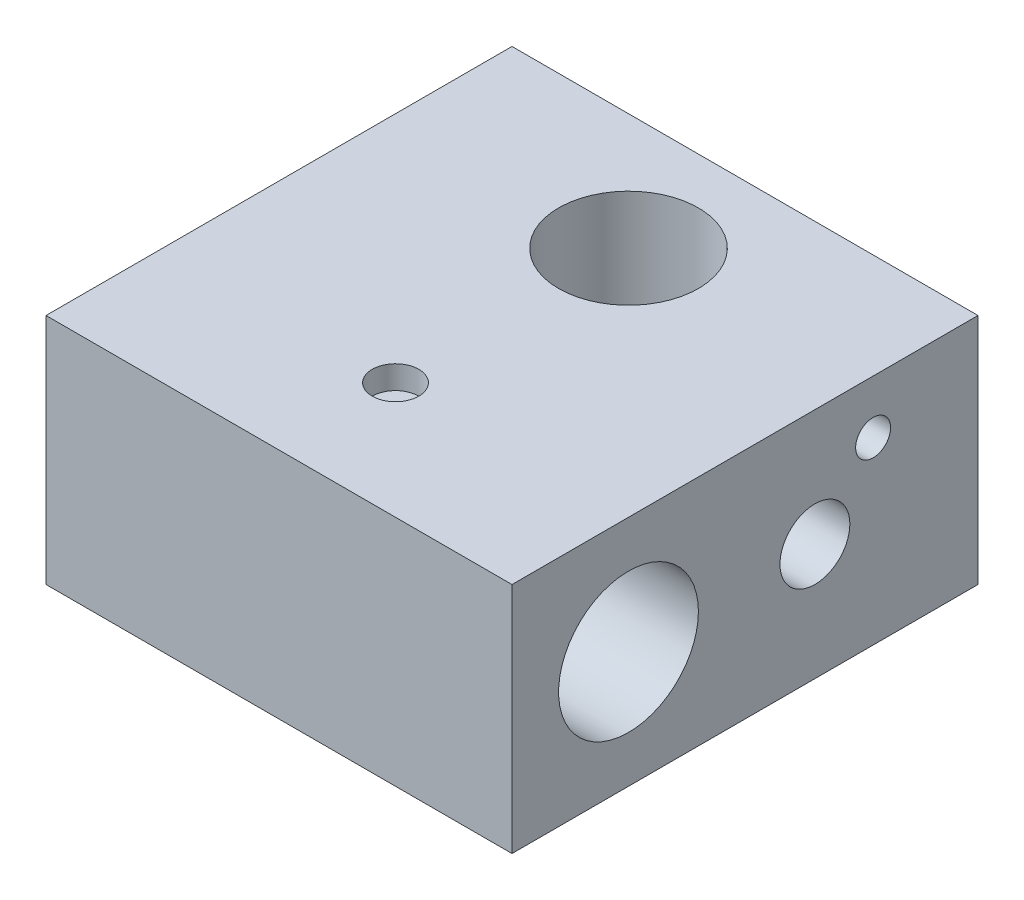
ISO-10303-21;
HEADER;
FILE_DESCRIPTION(('STEP AP214'),'2;1');
FILE_NAME('part.step','',(''),(''),'','','');
FILE_SCHEMA(('AUTOMOTIVE_DESIGN { 1 0 10303 214 1 1 1 1 }'));
ENDSEC;
DATA;
#1=APPLICATION_CONTEXT('core data for automotive mechanical design processes');
#2=APPLICATION_PROTOCOL_DEFINITION('international standard','automotive_design',2000,#1);
#3=PRODUCT_CONTEXT('',#1,'mechanical');
#4=PRODUCT('Part','Part','',(#3));
#5=PRODUCT_RELATED_PRODUCT_CATEGORY('part','',(#4));
#6=PRODUCT_DEFINITION_FORMATION('','',#4);
#7=PRODUCT_DEFINITION_CONTEXT('part definition',#1,'design');
#8=PRODUCT_DEFINITION('design','',#6,#7);
#9=PRODUCT_DEFINITION_SHAPE('','',#8);
#10=(LENGTH_UNIT() NAMED_UNIT(*) SI_UNIT(.MILLI.,.METRE.));
#11=(NAMED_UNIT(*) PLANE_ANGLE_UNIT() SI_UNIT($,.RADIAN.));
#12=(NAMED_UNIT(*) SI_UNIT($,.STERADIAN.) SOLID_ANGLE_UNIT());
#13=UNCERTAINTY_MEASURE_WITH_UNIT(LENGTH_MEASURE(1.E-05),#10,'distance_accuracy_value','');
#14=(GEOMETRIC_REPRESENTATION_CONTEXT(3) GLOBAL_UNCERTAINTY_ASSIGNED_CONTEXT((#13)) GLOBAL_UNIT_ASSIGNED_CONTEXT((#10,
#11,#12)) REPRESENTATION_CONTEXT('',''));
#15=CARTESIAN_POINT('',(0.,0.,0.));
#16=DIRECTION('',(0.,0.,1.));
#17=DIRECTION('',(1.,0.,0.));
#18=AXIS2_PLACEMENT_3D('',#15,#16,#17);
#19=CARTESIAN_POINT('',(10.,-5.,20.));
#20=DIRECTION('',(-1.,0.,0.));
#21=DIRECTION('',(0.,0.,1.));
#22=AXIS2_PLACEMENT_3D('',#19,#20,#21);
#23=PLANE('',#22);
#24=CARTESIAN_POINT('',(10.,0.,7.));
#25=DIRECTION('',(1.,0.,0.));
#26=DIRECTION('',(0.,0.,-1.));
#27=AXIS2_PLACEMENT_3D('',#24,#25,#26);
#28=CIRCLE('',#27,1.5);
#29=CARTESIAN_POINT('',(10.,0.,5.5));
#30=VERTEX_POINT('',#29);
#31=EDGE_CURVE('E133',#30,#30,#28,.T.);
#32=ORIENTED_EDGE('',*,*,#31,.F.);
#33=EDGE_LOOP('',(#32));
#34=FACE_BOUND('',#33,.T.);
#35=CARTESIAN_POINT('',(10.,2.71005655513205,4.50192394619593));
#36=DIRECTION('',(1.,0.,0.));
#37=DIRECTION('',(0.,0.,-1.));
#38=AXIS2_PLACEMENT_3D('',#35,#36,#37);
#39=CIRCLE('',#38,0.75);
#40=CARTESIAN_POINT('',(10.,2.71005655513205,3.75192394619593));
#41=VERTEX_POINT('',#40);
#42=EDGE_CURVE('E127',#41,#41,#39,.T.);
#43=ORIENTED_EDGE('',*,*,#42,.F.);
#44=EDGE_LOOP('',(#43));
#45=FACE_BOUND('',#44,.T.);
#46=CARTESIAN_POINT('',(10.,0.,15.));
#47=DIRECTION('',(1.,0.,0.));
#48=DIRECTION('',(0.,0.,-1.));
#49=AXIS2_PLACEMENT_3D('',#46,#47,#48);
#50=CIRCLE('',#49,3.);
#51=CARTESIAN_POINT('',(10.,0.,12.));
#52=VERTEX_POINT('',#51);
#53=EDGE_CURVE('E121',#52,#52,#50,.T.);
#54=ORIENTED_EDGE('',*,*,#53,.F.);
#55=EDGE_LOOP('',(#54));
#56=FACE_BOUND('',#55,.T.);
#57=DIRECTION('',(0.,1.,0.));
#58=VECTOR('',#57,1.);
#59=CARTESIAN_POINT('',(10.,-5.,0.));
#60=LINE('',#59,#58);
#61=CARTESIAN_POINT('',(10.,-5.,0.));
#62=VERTEX_POINT('',#61);
#63=CARTESIAN_POINT('',(10.,5.,0.));
#64=VERTEX_POINT('',#63);
#65=EDGE_CURVE('E95',#62,#64,#60,.T.);
#66=ORIENTED_EDGE('',*,*,#65,.T.);
#67=DIRECTION('',(0.,0.,-1.));
#68=VECTOR('',#67,1.);
#69=CARTESIAN_POINT('',(10.,5.,20.));
#70=LINE('',#69,#68);
#71=CARTESIAN_POINT('',(10.,5.,20.));
#72=VERTEX_POINT('',#71);
#73=EDGE_CURVE('E11',#72,#64,#70,.T.);
#74=ORIENTED_EDGE('',*,*,#73,.F.);
#75=DIRECTION('',(0.,1.,0.));
#76=VECTOR('',#75,1.);
#77=CARTESIAN_POINT('',(10.,-5.,20.));
#78=LINE('',#77,#76);
#79=CARTESIAN_POINT('',(10.,-5.,20.));
#80=VERTEX_POINT('',#79);
#81=EDGE_CURVE('E83',#80,#72,#78,.T.);
#82=ORIENTED_EDGE('',*,*,#81,.F.);
#83=DIRECTION('',(0.,0.,-1.));
#84=VECTOR('',#83,1.);
#85=CARTESIAN_POINT('',(10.,-5.,20.));
#86=LINE('',#85,#84);
#87=EDGE_CURVE('E91',#80,#62,#86,.T.);
#88=ORIENTED_EDGE('',*,*,#87,.T.);
#89=EDGE_LOOP('',(#66,#74,#82,#88));
#90=FACE_BOUND('',#89,.T.);
#91=ADVANCED_FACE('F32',(#34,#45,#56,#90),#23,.F.);
#92=CARTESIAN_POINT('',(-10.,5.,20.));
#93=DIRECTION('',(0.,-1.,0.));
#94=DIRECTION('',(0.,0.,-1.));
#95=AXIS2_PLACEMENT_3D('',#92,#93,#94);
#96=PLANE('',#95);
#97=CARTESIAN_POINT('',(0.,5.,15.));
#98=DIRECTION('',(0.,1.,0.));
#99=DIRECTION('',(0.,0.,1.));
#100=AXIS2_PLACEMENT_3D('',#97,#98,#99);
#101=CIRCLE('',#100,1.);
#102=CARTESIAN_POINT('',(0.,5.,16.));
#103=VERTEX_POINT('',#102);
#104=EDGE_CURVE('E115',#103,#103,#101,.T.);
#105=ORIENTED_EDGE('',*,*,#104,.F.);
#106=EDGE_LOOP('',(#105));
#107=FACE_BOUND('',#106,.T.);
#108=CARTESIAN_POINT('',(0.,5.,5.));
#109=DIRECTION('',(0.,1.,0.));
#110=DIRECTION('',(0.,0.,1.));
#111=AXIS2_PLACEMENT_3D('',#108,#109,#110);
#112=CIRCLE('',#111,3.);
#113=CARTESIAN_POINT('',(0.,5.,8.));
#114=VERTEX_POINT('',#113);
#115=EDGE_CURVE('E109',#114,#114,#112,.T.);
#116=ORIENTED_EDGE('',*,*,#115,.F.);
#117=EDGE_LOOP('',(#116));
#118=FACE_BOUND('',#117,.T.);
#119=DIRECTION('',(-1.,0.,0.));
#120=VECTOR('',#119,1.);
#121=CARTESIAN_POINT('',(-10.,5.,0.));
#122=LINE('',#121,#120);
#123=CARTESIAN_POINT('',(-10.,5.,0.));
#124=VERTEX_POINT('',#123);
#125=EDGE_CURVE('E87',#64,#124,#122,.T.);
#126=ORIENTED_EDGE('',*,*,#125,.T.);
#127=DIRECTION('',(0.,0.,-1.));
#128=VECTOR('',#127,1.);
#129=CARTESIAN_POINT('',(-10.,5.,20.));
#130=LINE('',#129,#128);
#131=CARTESIAN_POINT('',(-10.,5.,20.));
#132=VERTEX_POINT('',#131);
#133=EDGE_CURVE('E40',#132,#124,#130,.T.);
#134=ORIENTED_EDGE('',*,*,#133,.F.);
#135=DIRECTION('',(-1.,0.,0.));
#136=VECTOR('',#135,1.);
#137=CARTESIAN_POINT('',(-10.,5.,20.));
#138=LINE('',#137,#136);
#139=EDGE_CURVE('E78',#72,#132,#138,.T.);
#140=ORIENTED_EDGE('',*,*,#139,.F.);
#141=ORIENTED_EDGE('',*,*,#73,.T.);
#142=EDGE_LOOP('',(#126,#134,#140,#141));
#143=FACE_BOUND('',#142,.T.);
#144=ADVANCED_FACE('F86',(#107,#118,#143),#96,.F.);
#145=CARTESIAN_POINT('',(-10.,-5.,20.));
#146=DIRECTION('',(1.,0.,0.));
#147=DIRECTION('',(0.,0.,-1.));
#148=AXIS2_PLACEMENT_3D('',#145,#146,#147);
#149=PLANE('',#148);
#150=CARTESIAN_POINT('',(-10.,0.,15.));
#151=DIRECTION('',(1.,0.,0.));
#152=DIRECTION('',(0.,0.,-1.));
#153=AXIS2_PLACEMENT_3D('',#150,#151,#152);
#154=CIRCLE('',#153,3.);
#155=CARTESIAN_POINT('',(-10.,0.,12.));
#156=VERTEX_POINT('',#155);
#157=EDGE_CURVE('E118',#156,#156,#154,.T.);
#158=ORIENTED_EDGE('',*,*,#157,.T.);
#159=EDGE_LOOP('',(#158));
#160=FACE_BOUND('',#159,.T.);
#161=DIRECTION('',(0.,-1.,0.));
#162=VECTOR('',#161,1.);
#163=CARTESIAN_POINT('',(-10.,-5.,0.));
#164=LINE('',#163,#162);
#165=CARTESIAN_POINT('',(-10.,-5.,0.));
#166=VERTEX_POINT('',#165);
#167=EDGE_CURVE('E65',#124,#166,#164,.T.);
#168=ORIENTED_EDGE('',*,*,#167,.T.);
#169=DIRECTION('',(0.,0.,-1.));
#170=VECTOR('',#169,1.);
#171=CARTESIAN_POINT('',(-10.,-5.,20.));
#172=LINE('',#171,#170);
#173=CARTESIAN_POINT('',(-10.,-5.,20.));
#174=VERTEX_POINT('',#173);
#175=EDGE_CURVE('E88',#174,#166,#172,.T.);
#176=ORIENTED_EDGE('',*,*,#175,.F.);
#177=DIRECTION('',(0.,-1.,0.));
#178=VECTOR('',#177,1.);
#179=CARTESIAN_POINT('',(-10.,-5.,20.));
#180=LINE('',#179,#178);
#181=EDGE_CURVE('E81',#132,#174,#180,.T.);
#182=ORIENTED_EDGE('',*,*,#181,.F.);
#183=ORIENTED_EDGE('',*,*,#133,.T.);
#184=EDGE_LOOP('',(#168,#176,#182,#183));
#185=FACE_BOUND('',#184,.T.);
#186=ADVANCED_FACE('F89',(#160,#185),#149,.F.);
#187=CARTESIAN_POINT('',(-10.,-5.,20.));
#188=DIRECTION('',(0.,1.,0.));
#189=DIRECTION('',(0.,0.,1.));
#190=AXIS2_PLACEMENT_3D('',#187,#188,#189);
#191=PLANE('',#190);
#192=CARTESIAN_POINT('',(0.,-5.,5.));
#193=DIRECTION('',(0.,1.,0.));
#194=DIRECTION('',(0.,0.,1.));
#195=AXIS2_PLACEMENT_3D('',#192,#193,#194);
#196=CIRCLE('',#195,3.);
#197=CARTESIAN_POINT('',(0.,-5.,8.));
#198=VERTEX_POINT('',#197);
#199=EDGE_CURVE('E98',#198,#198,#196,.T.);
#200=ORIENTED_EDGE('',*,*,#199,.T.);
#201=EDGE_LOOP('',(#200));
#202=FACE_BOUND('',#201,.T.);
#203=DIRECTION('',(1.,0.,0.));
#204=VECTOR('',#203,1.);
#205=CARTESIAN_POINT('',(-10.,-5.,0.));
#206=LINE('',#205,#204);
#207=EDGE_CURVE('E71',#166,#62,#206,.T.);
#208=ORIENTED_EDGE('',*,*,#207,.T.);
#209=ORIENTED_EDGE('',*,*,#87,.F.);
#210=DIRECTION('',(1.,0.,0.));
#211=VECTOR('',#210,1.);
#212=CARTESIAN_POINT('',(-10.,-5.,20.));
#213=LINE('',#212,#211);
#214=EDGE_CURVE('E48',#174,#80,#213,.T.);
#215=ORIENTED_EDGE('',*,*,#214,.F.);
#216=ORIENTED_EDGE('',*,*,#175,.T.);
#217=EDGE_LOOP('',(#208,#209,#215,#216));
#218=FACE_BOUND('',#217,.T.);
#219=ADVANCED_FACE('F103',(#202,#218),#191,.F.);
#220=CARTESIAN_POINT('',(0.,0.,20.));
#221=DIRECTION('',(0.,0.,-1.));
#222=DIRECTION('',(-1.,0.,0.));
#223=AXIS2_PLACEMENT_3D('',#220,#221,#222);
#224=PLANE('',#223);
#225=ORIENTED_EDGE('',*,*,#81,.T.);
#226=ORIENTED_EDGE('',*,*,#139,.T.);
#227=ORIENTED_EDGE('',*,*,#181,.T.);
#228=ORIENTED_EDGE('',*,*,#214,.T.);
#229=EDGE_LOOP('',(#225,#226,#227,#228));
#230=FACE_BOUND('',#229,.T.);
#231=ADVANCED_FACE('F79',(#230),#224,.F.);
#232=CARTESIAN_POINT('',(0.,0.,0.));
#233=DIRECTION('',(0.,0.,-1.));
#234=DIRECTION('',(-1.,0.,0.));
#235=AXIS2_PLACEMENT_3D('',#232,#233,#234);
#236=PLANE('',#235);
#237=ORIENTED_EDGE('',*,*,#65,.F.);
#238=ORIENTED_EDGE('',*,*,#207,.F.);
#239=ORIENTED_EDGE('',*,*,#167,.F.);
#240=ORIENTED_EDGE('',*,*,#125,.F.);
#241=EDGE_LOOP('',(#237,#238,#239,#240));
#242=FACE_BOUND('',#241,.T.);
#243=ADVANCED_FACE('F106',(#242),#236,.T.);
#244=CARTESIAN_POINT('',(0.,-5.,5.));
#245=DIRECTION('',(0.,1.,0.));
#246=DIRECTION('',(0.,0.,1.));
#247=AXIS2_PLACEMENT_3D('',#244,#245,#246);
#248=CYLINDRICAL_SURFACE('',#247,3.);
#249=ORIENTED_EDGE('',*,*,#199,.F.);
#250=EDGE_LOOP('',(#249));
#251=FACE_BOUND('',#250,.T.);
#252=ORIENTED_EDGE('',*,*,#115,.T.);
#253=EDGE_LOOP('',(#252));
#254=FACE_BOUND('',#253,.T.);
#255=ADVANCED_FACE('F174',(#251,#254),#248,.F.);
#256=CARTESIAN_POINT('',(0.,4.,15.));
#257=DIRECTION('',(0.,1.,0.));
#258=DIRECTION('',(0.,0.,1.));
#259=AXIS2_PLACEMENT_3D('',#256,#257,#258);
#260=CYLINDRICAL_SURFACE('',#259,1.);
#261=CARTESIAN_POINT('',(0.,4.,15.));
#262=DIRECTION('',(0.,1.,0.));
#263=DIRECTION('',(0.,0.,1.));
#264=AXIS2_PLACEMENT_3D('',#261,#262,#263);
#265=CIRCLE('',#264,1.);
#266=CARTESIAN_POINT('',(0.,4.,16.));
#267=VERTEX_POINT('',#266);
#268=EDGE_CURVE('E112',#267,#267,#265,.T.);
#269=ORIENTED_EDGE('',*,*,#268,.F.);
#270=EDGE_LOOP('',(#269));
#271=FACE_BOUND('',#270,.T.);
#272=ORIENTED_EDGE('',*,*,#104,.T.);
#273=EDGE_LOOP('',(#272));
#274=FACE_BOUND('',#273,.T.);
#275=ADVANCED_FACE('F166',(#271,#274),#260,.F.);
#276=CARTESIAN_POINT('',(0.,4.,15.));
#277=DIRECTION('',(0.,1.,0.));
#278=DIRECTION('',(0.,0.,1.));
#279=AXIS2_PLACEMENT_3D('',#276,#277,#278);
#280=PLANE('',#279);
#281=ORIENTED_EDGE('',*,*,#268,.T.);
#282=EDGE_LOOP('',(#281));
#283=FACE_BOUND('',#282,.T.);
#284=ADVANCED_FACE('F157',(#283),#280,.T.);
#285=CARTESIAN_POINT('',(-10.,0.,15.));
#286=DIRECTION('',(1.,0.,0.));
#287=DIRECTION('',(0.,0.,-1.));
#288=AXIS2_PLACEMENT_3D('',#285,#286,#287);
#289=CYLINDRICAL_SURFACE('',#288,3.);
#290=ORIENTED_EDGE('',*,*,#157,.F.);
#291=EDGE_LOOP('',(#290));
#292=FACE_BOUND('',#291,.T.);
#293=ORIENTED_EDGE('',*,*,#53,.T.);
#294=EDGE_LOOP('',(#293));
#295=FACE_BOUND('',#294,.T.);
#296=ADVANCED_FACE('F154',(#292,#295),#289,.F.);
#297=CARTESIAN_POINT('',(6.,2.71005655513205,4.50192394619593));
#298=DIRECTION('',(1.,0.,0.));
#299=DIRECTION('',(0.,0.,-1.));
#300=AXIS2_PLACEMENT_3D('',#297,#298,#299);
#301=CYLINDRICAL_SURFACE('',#300,0.75);
#302=CARTESIAN_POINT('',(6.,2.71005655513205,4.50192394619593));
#303=DIRECTION('',(1.,0.,0.));
#304=DIRECTION('',(0.,0.,-1.));
#305=AXIS2_PLACEMENT_3D('',#302,#303,#304);
#306=CIRCLE('',#305,0.75);
#307=CARTESIAN_POINT('',(6.,2.71005655513205,3.75192394619593));
#308=VERTEX_POINT('',#307);
#309=EDGE_CURVE('E130',#308,#308,#306,.T.);
#310=ORIENTED_EDGE('',*,*,#309,.F.);
#311=EDGE_LOOP('',(#310));
#312=FACE_BOUND('',#311,.T.);
#313=ORIENTED_EDGE('',*,*,#42,.T.);
#314=EDGE_LOOP('',(#313));
#315=FACE_BOUND('',#314,.T.);
#316=ADVANCED_FACE('F156',(#312,#315),#301,.F.);
#317=CARTESIAN_POINT('',(6.,2.71005655513205,4.50192394619593));
#318=DIRECTION('',(1.,0.,0.));
#319=DIRECTION('',(0.,0.,-1.));
#320=AXIS2_PLACEMENT_3D('',#317,#318,#319);
#321=PLANE('',#320);
#322=ORIENTED_EDGE('',*,*,#309,.T.);
#323=EDGE_LOOP('',(#322));
#324=FACE_BOUND('',#323,.T.);
#325=ADVANCED_FACE('F144',(#324),#321,.T.);
#326=CARTESIAN_POINT('',(6.,0.,7.));
#327=DIRECTION('',(1.,0.,0.));
#328=DIRECTION('',(0.,0.,-1.));
#329=AXIS2_PLACEMENT_3D('',#326,#327,#328);
#330=CYLINDRICAL_SURFACE('',#329,1.5);
#331=CARTESIAN_POINT('',(6.,0.,7.));
#332=DIRECTION('',(1.,0.,0.));
#333=DIRECTION('',(0.,0.,-1.));
#334=AXIS2_PLACEMENT_3D('',#331,#332,#333);
#335=CIRCLE('',#334,1.5);
#336=CARTESIAN_POINT('',(6.,0.,5.5));
#337=VERTEX_POINT('',#336);
#338=EDGE_CURVE('E124',#337,#337,#335,.T.);
#339=ORIENTED_EDGE('',*,*,#338,.F.);
#340=EDGE_LOOP('',(#339));
#341=FACE_BOUND('',#340,.T.);
#342=ORIENTED_EDGE('',*,*,#31,.T.);
#343=EDGE_LOOP('',(#342));
#344=FACE_BOUND('',#343,.T.);
#345=ADVANCED_FACE('F141',(#341,#344),#330,.F.);
#346=CARTESIAN_POINT('',(6.,0.,7.));
#347=DIRECTION('',(1.,0.,0.));
#348=DIRECTION('',(0.,0.,-1.));
#349=AXIS2_PLACEMENT_3D('',#346,#347,#348);
#350=PLANE('',#349);
#351=ORIENTED_EDGE('',*,*,#338,.T.);
#352=EDGE_LOOP('',(#351));
#353=FACE_BOUND('',#352,.T.);
#354=ADVANCED_FACE('F139',(#353),#350,.T.);
#355=CLOSED_SHELL('',(#91,#144,#186,#219,#231,#243,#255,#275,#284,#296,#316,#325,#345,#354));
#356=MANIFOLD_SOLID_BREP('B2',#355);
#357=ADVANCED_BREP_SHAPE_REPRESENTATION('',(#18,#356),#14);
#358=SHAPE_DEFINITION_REPRESENTATION(#9,#357);
ENDSEC;
END-ISO-10303-21;
